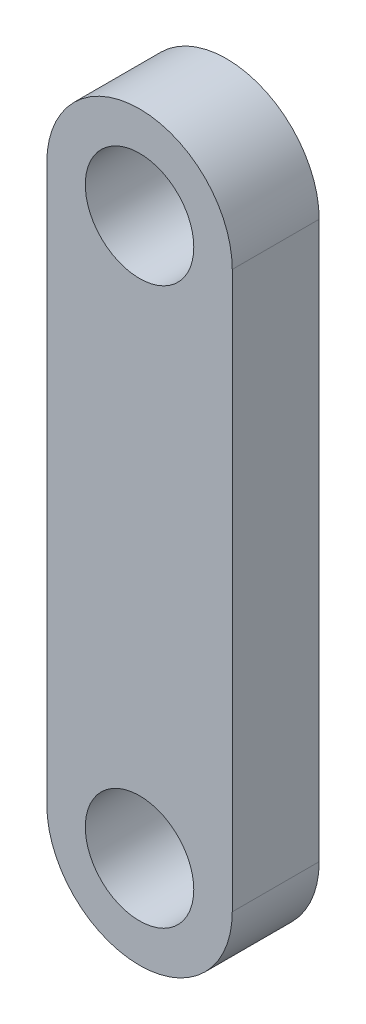
ISO-10303-21;
HEADER;
FILE_DESCRIPTION(('STEP AP214'),'2;1');
FILE_NAME('part.step','',(''),(''),'','','');
FILE_SCHEMA(('AUTOMOTIVE_DESIGN { 1 0 10303 214 1 1 1 1 }'));
ENDSEC;
DATA;
#1=APPLICATION_CONTEXT('core data for automotive mechanical design processes');
#2=APPLICATION_PROTOCOL_DEFINITION('international standard','automotive_design',2000,#1);
#3=PRODUCT_CONTEXT('',#1,'mechanical');
#4=PRODUCT('Part','Part','',(#3));
#5=PRODUCT_RELATED_PRODUCT_CATEGORY('part','',(#4));
#6=PRODUCT_DEFINITION_FORMATION('','',#4);
#7=PRODUCT_DEFINITION_CONTEXT('part definition',#1,'design');
#8=PRODUCT_DEFINITION('design','',#6,#7);
#9=PRODUCT_DEFINITION_SHAPE('','',#8);
#10=(LENGTH_UNIT() NAMED_UNIT(*) SI_UNIT(.MILLI.,.METRE.));
#11=(NAMED_UNIT(*) PLANE_ANGLE_UNIT() SI_UNIT($,.RADIAN.));
#12=(NAMED_UNIT(*) SI_UNIT($,.STERADIAN.) SOLID_ANGLE_UNIT());
#13=UNCERTAINTY_MEASURE_WITH_UNIT(LENGTH_MEASURE(1.E-05),#10,'distance_accuracy_value','');
#14=(GEOMETRIC_REPRESENTATION_CONTEXT(3) GLOBAL_UNCERTAINTY_ASSIGNED_CONTEXT((#13)) GLOBAL_UNIT_ASSIGNED_CONTEXT((#10,
#11,#12)) REPRESENTATION_CONTEXT('',''));
#15=CARTESIAN_POINT('',(0.,0.,0.));
#16=DIRECTION('',(0.,0.,1.));
#17=DIRECTION('',(1.,0.,0.));
#18=AXIS2_PLACEMENT_3D('',#15,#16,#17);
#19=CARTESIAN_POINT('',(0.,19.2,3.));
#20=DIRECTION('',(0.,0.,1.));
#21=DIRECTION('',(1.,0.,0.));
#22=AXIS2_PLACEMENT_3D('',#19,#20,#21);
#23=PLANE('',#22);
#24=CARTESIAN_POINT('',(0.,0.,3.));
#25=DIRECTION('',(0.,0.,1.));
#26=DIRECTION('',(1.,0.,0.));
#27=AXIS2_PLACEMENT_3D('',#24,#25,#26);
#28=CIRCLE('',#27,1.872);
#29=CARTESIAN_POINT('',(1.872,0.,3.));
#30=VERTEX_POINT('',#29);
#31=EDGE_CURVE('E108',#30,#30,#28,.T.);
#32=ORIENTED_EDGE('',*,*,#31,.F.);
#33=EDGE_LOOP('',(#32));
#34=FACE_BOUND('',#33,.T.);
#35=CARTESIAN_POINT('',(0.,19.2,3.));
#36=DIRECTION('',(0.,0.,1.));
#37=DIRECTION('',(1.,0.,0.));
#38=AXIS2_PLACEMENT_3D('',#35,#36,#37);
#39=CIRCLE('',#38,3.2);
#40=CARTESIAN_POINT('',(3.2,19.2,3.));
#41=VERTEX_POINT('',#40);
#42=CARTESIAN_POINT('',(-3.2,19.2,3.));
#43=VERTEX_POINT('',#42);
#44=EDGE_CURVE('E93',#41,#43,#39,.T.);
#45=ORIENTED_EDGE('',*,*,#44,.T.);
#46=DIRECTION('',(0.,-1.,0.));
#47=VECTOR('',#46,1.);
#48=CARTESIAN_POINT('',(-3.2,19.2,3.));
#49=LINE('',#48,#47);
#50=CARTESIAN_POINT('',(-3.2,0.,3.));
#51=VERTEX_POINT('',#50);
#52=EDGE_CURVE('E88',#43,#51,#49,.T.);
#53=ORIENTED_EDGE('',*,*,#52,.T.);
#54=CARTESIAN_POINT('',(0.,0.,3.));
#55=DIRECTION('',(0.,0.,1.));
#56=DIRECTION('',(1.,0.,0.));
#57=AXIS2_PLACEMENT_3D('',#54,#55,#56);
#58=CIRCLE('',#57,3.2);
#59=CARTESIAN_POINT('',(3.19999999999999,0.,3.));
#60=VERTEX_POINT('',#59);
#61=EDGE_CURVE('E91',#51,#60,#58,.T.);
#62=ORIENTED_EDGE('',*,*,#61,.T.);
#63=DIRECTION('',(0.,1.,0.));
#64=VECTOR('',#63,1.);
#65=CARTESIAN_POINT('',(3.2,19.2,3.));
#66=LINE('',#65,#64);
#67=EDGE_CURVE('E58',#60,#41,#66,.T.);
#68=ORIENTED_EDGE('',*,*,#67,.T.);
#69=EDGE_LOOP('',(#45,#53,#62,#68));
#70=FACE_BOUND('',#69,.T.);
#71=CARTESIAN_POINT('',(0.,19.2,3.));
#72=DIRECTION('',(0.,0.,1.));
#73=DIRECTION('',(1.,0.,0.));
#74=AXIS2_PLACEMENT_3D('',#71,#72,#73);
#75=CIRCLE('',#74,1.872);
#76=CARTESIAN_POINT('',(1.872,19.2,3.));
#77=VERTEX_POINT('',#76);
#78=EDGE_CURVE('E123',#77,#77,#75,.T.);
#79=ORIENTED_EDGE('',*,*,#78,.F.);
#80=EDGE_LOOP('',(#79));
#81=FACE_BOUND('',#80,.T.);
#82=ADVANCED_FACE('F41',(#34,#70,#81),#23,.T.);
#83=CARTESIAN_POINT('',(0.,19.2,0.));
#84=DIRECTION('',(0.,0.,1.));
#85=DIRECTION('',(1.,0.,0.));
#86=AXIS2_PLACEMENT_3D('',#83,#84,#85);
#87=PLANE('',#86);
#88=CARTESIAN_POINT('',(0.,19.2,0.));
#89=DIRECTION('',(0.,0.,1.));
#90=DIRECTION('',(1.,0.,0.));
#91=AXIS2_PLACEMENT_3D('',#88,#89,#90);
#92=CIRCLE('',#91,3.2);
#93=CARTESIAN_POINT('',(3.2,19.2,0.));
#94=VERTEX_POINT('',#93);
#95=CARTESIAN_POINT('',(-3.2,19.2,0.));
#96=VERTEX_POINT('',#95);
#97=EDGE_CURVE('E105',#94,#96,#92,.T.);
#98=ORIENTED_EDGE('',*,*,#97,.F.);
#99=DIRECTION('',(0.,1.,0.));
#100=VECTOR('',#99,1.);
#101=CARTESIAN_POINT('',(3.2,19.2,0.));
#102=LINE('',#101,#100);
#103=CARTESIAN_POINT('',(3.19999999999999,0.,0.));
#104=VERTEX_POINT('',#103);
#105=EDGE_CURVE('E81',#104,#94,#102,.T.);
#106=ORIENTED_EDGE('',*,*,#105,.F.);
#107=CARTESIAN_POINT('',(0.,0.,0.));
#108=DIRECTION('',(0.,0.,1.));
#109=DIRECTION('',(1.,0.,0.));
#110=AXIS2_PLACEMENT_3D('',#107,#108,#109);
#111=CIRCLE('',#110,3.2);
#112=CARTESIAN_POINT('',(-3.2,0.,0.));
#113=VERTEX_POINT('',#112);
#114=EDGE_CURVE('E75',#113,#104,#111,.T.);
#115=ORIENTED_EDGE('',*,*,#114,.F.);
#116=DIRECTION('',(0.,-1.,0.));
#117=VECTOR('',#116,1.);
#118=CARTESIAN_POINT('',(-3.2,19.2,0.));
#119=LINE('',#118,#117);
#120=EDGE_CURVE('E97',#96,#113,#119,.T.);
#121=ORIENTED_EDGE('',*,*,#120,.F.);
#122=EDGE_LOOP('',(#98,#106,#115,#121));
#123=FACE_BOUND('',#122,.T.);
#124=CARTESIAN_POINT('',(0.,0.,0.));
#125=DIRECTION('',(0.,0.,1.));
#126=DIRECTION('',(1.,0.,0.));
#127=AXIS2_PLACEMENT_3D('',#124,#125,#126);
#128=CIRCLE('',#127,1.872);
#129=CARTESIAN_POINT('',(1.872,0.,0.));
#130=VERTEX_POINT('',#129);
#131=EDGE_CURVE('E120',#130,#130,#128,.T.);
#132=ORIENTED_EDGE('',*,*,#131,.T.);
#133=EDGE_LOOP('',(#132));
#134=FACE_BOUND('',#133,.T.);
#135=CARTESIAN_POINT('',(0.,19.2,0.));
#136=DIRECTION('',(0.,0.,1.));
#137=DIRECTION('',(1.,0.,0.));
#138=AXIS2_PLACEMENT_3D('',#135,#136,#137);
#139=CIRCLE('',#138,1.872);
#140=CARTESIAN_POINT('',(1.872,19.2,0.));
#141=VERTEX_POINT('',#140);
#142=EDGE_CURVE('E126',#141,#141,#139,.T.);
#143=ORIENTED_EDGE('',*,*,#142,.T.);
#144=EDGE_LOOP('',(#143));
#145=FACE_BOUND('',#144,.T.);
#146=ADVANCED_FACE('F116',(#123,#134,#145),#87,.F.);
#147=CARTESIAN_POINT('',(0.,19.2,3.));
#148=DIRECTION('',(0.,0.,-1.));
#149=DIRECTION('',(-1.,0.,0.));
#150=AXIS2_PLACEMENT_3D('',#147,#148,#149);
#151=CYLINDRICAL_SURFACE('',#150,3.2);
#152=ORIENTED_EDGE('',*,*,#97,.T.);
#153=DIRECTION('',(0.,0.,-1.));
#154=VECTOR('',#153,1.);
#155=CARTESIAN_POINT('',(-3.2,19.2,3.));
#156=LINE('',#155,#154);
#157=EDGE_CURVE('E11',#43,#96,#156,.T.);
#158=ORIENTED_EDGE('',*,*,#157,.F.);
#159=ORIENTED_EDGE('',*,*,#44,.F.);
#160=DIRECTION('',(0.,0.,-1.));
#161=VECTOR('',#160,1.);
#162=CARTESIAN_POINT('',(3.2,19.2,3.));
#163=LINE('',#162,#161);
#164=EDGE_CURVE('E101',#41,#94,#163,.T.);
#165=ORIENTED_EDGE('',*,*,#164,.T.);
#166=EDGE_LOOP('',(#152,#158,#159,#165));
#167=FACE_BOUND('',#166,.T.);
#168=ADVANCED_FACE('F43',(#167),#151,.T.);
#169=CARTESIAN_POINT('',(-3.2,19.2,3.));
#170=DIRECTION('',(1.,0.,0.));
#171=DIRECTION('',(0.,1.,0.));
#172=AXIS2_PLACEMENT_3D('',#169,#170,#171);
#173=PLANE('',#172);
#174=ORIENTED_EDGE('',*,*,#120,.T.);
#175=DIRECTION('',(0.,0.,-1.));
#176=VECTOR('',#175,1.);
#177=CARTESIAN_POINT('',(-3.2,0.,3.));
#178=LINE('',#177,#176);
#179=EDGE_CURVE('E50',#51,#113,#178,.T.);
#180=ORIENTED_EDGE('',*,*,#179,.F.);
#181=ORIENTED_EDGE('',*,*,#52,.F.);
#182=ORIENTED_EDGE('',*,*,#157,.T.);
#183=EDGE_LOOP('',(#174,#180,#181,#182));
#184=FACE_BOUND('',#183,.T.);
#185=ADVANCED_FACE('F96',(#184),#173,.F.);
#186=CARTESIAN_POINT('',(0.,0.,3.));
#187=DIRECTION('',(0.,0.,-1.));
#188=DIRECTION('',(-1.,0.,0.));
#189=AXIS2_PLACEMENT_3D('',#186,#187,#188);
#190=CYLINDRICAL_SURFACE('',#189,3.2);
#191=ORIENTED_EDGE('',*,*,#114,.T.);
#192=DIRECTION('',(0.,0.,-1.));
#193=VECTOR('',#192,1.);
#194=CARTESIAN_POINT('',(3.19999999999999,0.,3.));
#195=LINE('',#194,#193);
#196=EDGE_CURVE('E98',#60,#104,#195,.T.);
#197=ORIENTED_EDGE('',*,*,#196,.F.);
#198=ORIENTED_EDGE('',*,*,#61,.F.);
#199=ORIENTED_EDGE('',*,*,#179,.T.);
#200=EDGE_LOOP('',(#191,#197,#198,#199));
#201=FACE_BOUND('',#200,.T.);
#202=ADVANCED_FACE('F99',(#201),#190,.T.);
#203=CARTESIAN_POINT('',(3.2,19.2,3.));
#204=DIRECTION('',(-1.,0.,0.));
#205=DIRECTION('',(0.,-1.,0.));
#206=AXIS2_PLACEMENT_3D('',#203,#204,#205);
#207=PLANE('',#206);
#208=ORIENTED_EDGE('',*,*,#105,.T.);
#209=ORIENTED_EDGE('',*,*,#164,.F.);
#210=ORIENTED_EDGE('',*,*,#67,.F.);
#211=ORIENTED_EDGE('',*,*,#196,.T.);
#212=EDGE_LOOP('',(#208,#209,#210,#211));
#213=FACE_BOUND('',#212,.T.);
#214=ADVANCED_FACE('F113',(#213),#207,.F.);
#215=CARTESIAN_POINT('',(0.,0.,3.));
#216=DIRECTION('',(0.,0.,-1.));
#217=DIRECTION('',(-1.,0.,0.));
#218=AXIS2_PLACEMENT_3D('',#215,#216,#217);
#219=CYLINDRICAL_SURFACE('',#218,1.872);
#220=ORIENTED_EDGE('',*,*,#31,.T.);
#221=EDGE_LOOP('',(#220));
#222=FACE_BOUND('',#221,.T.);
#223=ORIENTED_EDGE('',*,*,#131,.F.);
#224=EDGE_LOOP('',(#223));
#225=FACE_BOUND('',#224,.T.);
#226=ADVANCED_FACE('F143',(#222,#225),#219,.F.);
#227=CARTESIAN_POINT('',(0.,19.2,3.));
#228=DIRECTION('',(0.,0.,-1.));
#229=DIRECTION('',(-1.,0.,0.));
#230=AXIS2_PLACEMENT_3D('',#227,#228,#229);
#231=CYLINDRICAL_SURFACE('',#230,1.872);
#232=ORIENTED_EDGE('',*,*,#78,.T.);
#233=EDGE_LOOP('',(#232));
#234=FACE_BOUND('',#233,.T.);
#235=ORIENTED_EDGE('',*,*,#142,.F.);
#236=EDGE_LOOP('',(#235));
#237=FACE_BOUND('',#236,.T.);
#238=ADVANCED_FACE('F132',(#234,#237),#231,.F.);
#239=CLOSED_SHELL('',(#82,#146,#168,#185,#202,#214,#226,#238));
#240=MANIFOLD_SOLID_BREP('B2',#239);
#241=ADVANCED_BREP_SHAPE_REPRESENTATION('',(#18,#240),#14);
#242=SHAPE_DEFINITION_REPRESENTATION(#9,#241);
ENDSEC;
END-ISO-10303-21;
